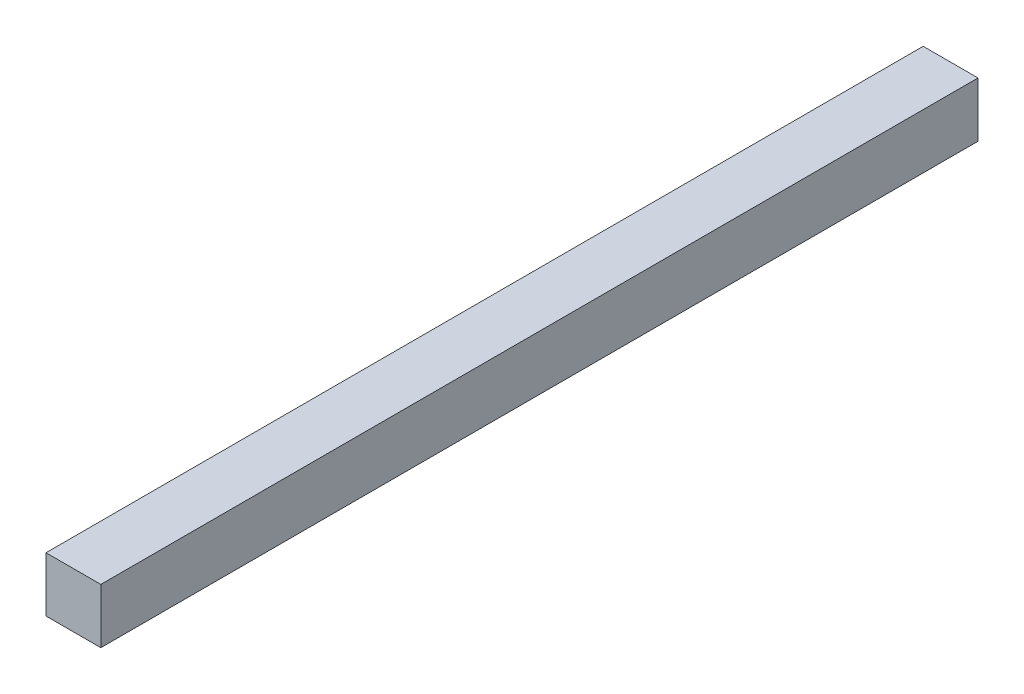
ISO-10303-21;
HEADER;
FILE_DESCRIPTION(('STEP AP214'),'2;1');
FILE_NAME('part.step','',(''),(''),'','','');
FILE_SCHEMA(('AUTOMOTIVE_DESIGN { 1 0 10303 214 1 1 1 1 }'));
ENDSEC;
DATA;
#1=APPLICATION_CONTEXT('core data for automotive mechanical design processes');
#2=APPLICATION_PROTOCOL_DEFINITION('international standard','automotive_design',2000,#1);
#3=PRODUCT_CONTEXT('',#1,'mechanical');
#4=PRODUCT('Part','Part','',(#3));
#5=PRODUCT_RELATED_PRODUCT_CATEGORY('part','',(#4));
#6=PRODUCT_DEFINITION_FORMATION('','',#4);
#7=PRODUCT_DEFINITION_CONTEXT('part definition',#1,'design');
#8=PRODUCT_DEFINITION('design','',#6,#7);
#9=PRODUCT_DEFINITION_SHAPE('','',#8);
#10=(LENGTH_UNIT() NAMED_UNIT(*) SI_UNIT(.MILLI.,.METRE.));
#11=(NAMED_UNIT(*) PLANE_ANGLE_UNIT() SI_UNIT($,.RADIAN.));
#12=(NAMED_UNIT(*) SI_UNIT($,.STERADIAN.) SOLID_ANGLE_UNIT());
#13=UNCERTAINTY_MEASURE_WITH_UNIT(LENGTH_MEASURE(1.E-05),#10,'distance_accuracy_value','');
#14=(GEOMETRIC_REPRESENTATION_CONTEXT(3) GLOBAL_UNCERTAINTY_ASSIGNED_CONTEXT((#13)) GLOBAL_UNIT_ASSIGNED_CONTEXT((#10,
#11,#12)) REPRESENTATION_CONTEXT('',''));
#15=CARTESIAN_POINT('',(0.,0.,0.));
#16=DIRECTION('',(0.,0.,1.));
#17=DIRECTION('',(1.,0.,0.));
#18=AXIS2_PLACEMENT_3D('',#15,#16,#17);
#19=CARTESIAN_POINT('',(0.,0.,800.));
#20=DIRECTION('',(-1.,0.,0.));
#21=DIRECTION('',(0.,-1.,0.));
#22=AXIS2_PLACEMENT_3D('',#19,#20,#21);
#23=PLANE('',#22);
#24=DIRECTION('',(0.,1.,0.));
#25=VECTOR('',#24,1.);
#26=CARTESIAN_POINT('',(0.,0.,0.));
#27=LINE('',#26,#25);
#28=CARTESIAN_POINT('',(0.,0.,0.));
#29=VERTEX_POINT('',#28);
#30=CARTESIAN_POINT('',(0.,50.,0.));
#31=VERTEX_POINT('',#30);
#32=EDGE_CURVE('E101',#29,#31,#27,.T.);
#33=ORIENTED_EDGE('',*,*,#32,.F.);
#34=DIRECTION('',(0.,0.,-1.));
#35=VECTOR('',#34,1.);
#36=CARTESIAN_POINT('',(0.,0.,800.));
#37=LINE('',#36,#35);
#38=CARTESIAN_POINT('',(0.,0.,800.));
#39=VERTEX_POINT('',#38);
#40=EDGE_CURVE('E11',#39,#29,#37,.T.);
#41=ORIENTED_EDGE('',*,*,#40,.F.);
#42=DIRECTION('',(0.,1.,0.));
#43=VECTOR('',#42,1.);
#44=CARTESIAN_POINT('',(0.,0.,800.));
#45=LINE('',#44,#43);
#46=CARTESIAN_POINT('',(0.,50.,800.));
#47=VERTEX_POINT('',#46);
#48=EDGE_CURVE('E96',#39,#47,#45,.T.);
#49=ORIENTED_EDGE('',*,*,#48,.T.);
#50=DIRECTION('',(0.,0.,-1.));
#51=VECTOR('',#50,1.);
#52=CARTESIAN_POINT('',(0.,50.,800.));
#53=LINE('',#52,#51);
#54=EDGE_CURVE('E39',#47,#31,#53,.T.);
#55=ORIENTED_EDGE('',*,*,#54,.T.);
#56=EDGE_LOOP('',(#33,#41,#49,#55));
#57=FACE_BOUND('',#56,.T.);
#58=ADVANCED_FACE('F36',(#57),#23,.T.);
#59=CARTESIAN_POINT('',(0.,0.,800.));
#60=DIRECTION('',(0.,1.,0.));
#61=DIRECTION('',(0.,0.,1.));
#62=AXIS2_PLACEMENT_3D('',#59,#60,#61);
#63=PLANE('',#62);
#64=DIRECTION('',(1.,0.,0.));
#65=VECTOR('',#64,1.);
#66=CARTESIAN_POINT('',(0.,0.,0.));
#67=LINE('',#66,#65);
#68=CARTESIAN_POINT('',(50.,0.,0.));
#69=VERTEX_POINT('',#68);
#70=EDGE_CURVE('E69',#29,#69,#67,.T.);
#71=ORIENTED_EDGE('',*,*,#70,.T.);
#72=DIRECTION('',(0.,0.,-1.));
#73=VECTOR('',#72,1.);
#74=CARTESIAN_POINT('',(50.,0.,800.));
#75=LINE('',#74,#73);
#76=CARTESIAN_POINT('',(50.,0.,800.));
#77=VERTEX_POINT('',#76);
#78=EDGE_CURVE('E45',#77,#69,#75,.T.);
#79=ORIENTED_EDGE('',*,*,#78,.F.);
#80=DIRECTION('',(1.,0.,0.));
#81=VECTOR('',#80,1.);
#82=CARTESIAN_POINT('',(0.,0.,800.));
#83=LINE('',#82,#81);
#84=EDGE_CURVE('E86',#39,#77,#83,.T.);
#85=ORIENTED_EDGE('',*,*,#84,.F.);
#86=ORIENTED_EDGE('',*,*,#40,.T.);
#87=EDGE_LOOP('',(#71,#79,#85,#86));
#88=FACE_BOUND('',#87,.T.);
#89=ADVANCED_FACE('F111',(#88),#63,.F.);
#90=CARTESIAN_POINT('',(50.,0.,800.));
#91=DIRECTION('',(-1.,0.,0.));
#92=DIRECTION('',(0.,-1.,0.));
#93=AXIS2_PLACEMENT_3D('',#90,#91,#92);
#94=PLANE('',#93);
#95=DIRECTION('',(0.,1.,0.));
#96=VECTOR('',#95,1.);
#97=CARTESIAN_POINT('',(50.,0.,0.));
#98=LINE('',#97,#96);
#99=CARTESIAN_POINT('',(50.,50.,0.));
#100=VERTEX_POINT('',#99);
#101=EDGE_CURVE('E93',#69,#100,#98,.T.);
#102=ORIENTED_EDGE('',*,*,#101,.T.);
#103=DIRECTION('',(0.,0.,-1.));
#104=VECTOR('',#103,1.);
#105=CARTESIAN_POINT('',(50.,50.,800.));
#106=LINE('',#105,#104);
#107=CARTESIAN_POINT('',(50.,50.,800.));
#108=VERTEX_POINT('',#107);
#109=EDGE_CURVE('E90',#108,#100,#106,.T.);
#110=ORIENTED_EDGE('',*,*,#109,.F.);
#111=DIRECTION('',(0.,1.,0.));
#112=VECTOR('',#111,1.);
#113=CARTESIAN_POINT('',(50.,0.,800.));
#114=LINE('',#113,#112);
#115=EDGE_CURVE('E81',#77,#108,#114,.T.);
#116=ORIENTED_EDGE('',*,*,#115,.F.);
#117=ORIENTED_EDGE('',*,*,#78,.T.);
#118=EDGE_LOOP('',(#102,#110,#116,#117));
#119=FACE_BOUND('',#118,.T.);
#120=ADVANCED_FACE('F91',(#119),#94,.F.);
#121=CARTESIAN_POINT('',(0.,50.,800.));
#122=DIRECTION('',(0.,1.,0.));
#123=DIRECTION('',(0.,0.,1.));
#124=AXIS2_PLACEMENT_3D('',#121,#122,#123);
#125=PLANE('',#124);
#126=DIRECTION('',(1.,0.,0.));
#127=VECTOR('',#126,1.);
#128=CARTESIAN_POINT('',(0.,50.,0.));
#129=LINE('',#128,#127);
#130=EDGE_CURVE('E104',#31,#100,#129,.T.);
#131=ORIENTED_EDGE('',*,*,#130,.F.);
#132=ORIENTED_EDGE('',*,*,#54,.F.);
#133=DIRECTION('',(1.,0.,0.));
#134=VECTOR('',#133,1.);
#135=CARTESIAN_POINT('',(0.,50.,800.));
#136=LINE('',#135,#134);
#137=EDGE_CURVE('E85',#47,#108,#136,.T.);
#138=ORIENTED_EDGE('',*,*,#137,.T.);
#139=ORIENTED_EDGE('',*,*,#109,.T.);
#140=EDGE_LOOP('',(#131,#132,#138,#139));
#141=FACE_BOUND('',#140,.T.);
#142=ADVANCED_FACE('F95',(#141),#125,.T.);
#143=CARTESIAN_POINT('',(0.,0.,800.));
#144=DIRECTION('',(0.,0.,-1.));
#145=DIRECTION('',(-1.,0.,0.));
#146=AXIS2_PLACEMENT_3D('',#143,#144,#145);
#147=PLANE('',#146);
#148=ORIENTED_EDGE('',*,*,#48,.F.);
#149=ORIENTED_EDGE('',*,*,#84,.T.);
#150=ORIENTED_EDGE('',*,*,#115,.T.);
#151=ORIENTED_EDGE('',*,*,#137,.F.);
#152=EDGE_LOOP('',(#148,#149,#150,#151));
#153=FACE_BOUND('',#152,.T.);
#154=ADVANCED_FACE('F84',(#153),#147,.F.);
#155=CARTESIAN_POINT('',(0.,0.,0.));
#156=DIRECTION('',(0.,0.,-1.));
#157=DIRECTION('',(-1.,0.,0.));
#158=AXIS2_PLACEMENT_3D('',#155,#156,#157);
#159=PLANE('',#158);
#160=ORIENTED_EDGE('',*,*,#32,.T.);
#161=ORIENTED_EDGE('',*,*,#130,.T.);
#162=ORIENTED_EDGE('',*,*,#101,.F.);
#163=ORIENTED_EDGE('',*,*,#70,.F.);
#164=EDGE_LOOP('',(#160,#161,#162,#163));
#165=FACE_BOUND('',#164,.T.);
#166=ADVANCED_FACE('F109',(#165),#159,.T.);
#167=CLOSED_SHELL('',(#58,#89,#120,#142,#154,#166));
#168=MANIFOLD_SOLID_BREP('B2',#167);
#169=ADVANCED_BREP_SHAPE_REPRESENTATION('',(#18,#168),#14);
#170=SHAPE_DEFINITION_REPRESENTATION(#9,#169);
ENDSEC;
END-ISO-10303-21;
